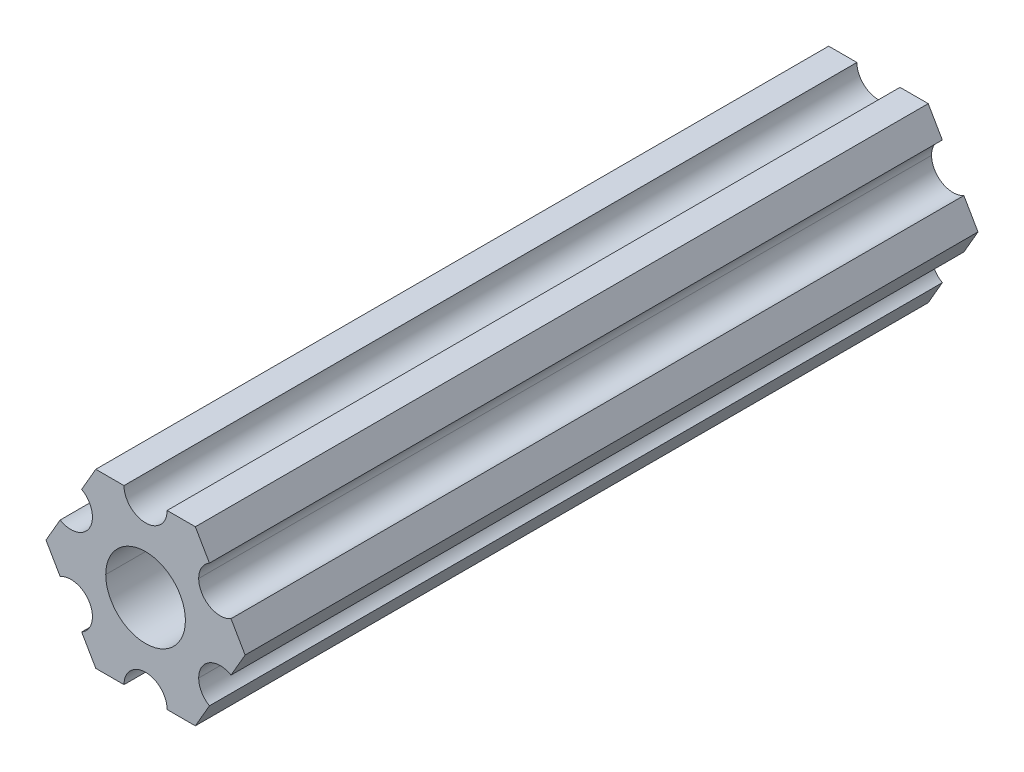
ISO-10303-21;
HEADER;
FILE_DESCRIPTION(('STEP AP214'),'2;1');
FILE_NAME('part.step','',(''),(''),'','','');
FILE_SCHEMA(('AUTOMOTIVE_DESIGN { 1 0 10303 214 1 1 1 1 }'));
ENDSEC;
DATA;
#1=APPLICATION_CONTEXT('core data for automotive mechanical design processes');
#2=APPLICATION_PROTOCOL_DEFINITION('international standard','automotive_design',2000,#1);
#3=PRODUCT_CONTEXT('',#1,'mechanical');
#4=PRODUCT('Part','Part','',(#3));
#5=PRODUCT_RELATED_PRODUCT_CATEGORY('part','',(#4));
#6=PRODUCT_DEFINITION_FORMATION('','',#4);
#7=PRODUCT_DEFINITION_CONTEXT('part definition',#1,'design');
#8=PRODUCT_DEFINITION('design','',#6,#7);
#9=PRODUCT_DEFINITION_SHAPE('','',#8);
#10=(LENGTH_UNIT() NAMED_UNIT(*) SI_UNIT(.MILLI.,.METRE.));
#11=(NAMED_UNIT(*) PLANE_ANGLE_UNIT() SI_UNIT($,.RADIAN.));
#12=(NAMED_UNIT(*) SI_UNIT($,.STERADIAN.) SOLID_ANGLE_UNIT());
#13=UNCERTAINTY_MEASURE_WITH_UNIT(LENGTH_MEASURE(1.E-05),#10,'distance_accuracy_value','');
#14=(GEOMETRIC_REPRESENTATION_CONTEXT(3) GLOBAL_UNCERTAINTY_ASSIGNED_CONTEXT((#13)) GLOBAL_UNIT_ASSIGNED_CONTEXT((#10,
#11,#12)) REPRESENTATION_CONTEXT('',''));
#15=CARTESIAN_POINT('',(0.,0.,0.));
#16=DIRECTION('',(0.,0.,1.));
#17=DIRECTION('',(1.,0.,0.));
#18=AXIS2_PLACEMENT_3D('',#15,#16,#17);
#19=CARTESIAN_POINT('',(0.,0.,304.8));
#20=DIRECTION('',(0.,0.,-1.));
#21=DIRECTION('',(-1.,0.,0.));
#22=AXIS2_PLACEMENT_3D('',#19,#20,#21);
#23=CYLINDRICAL_SURFACE('',#22,2.9337);
#24=CARTESIAN_POINT('',(0.,0.,53.975));
#25=DIRECTION('',(0.,0.,1.));
#26=DIRECTION('',(1.,0.,0.));
#27=AXIS2_PLACEMENT_3D('',#24,#25,#26);
#28=CIRCLE('',#27,2.9337);
#29=CARTESIAN_POINT('',(2.9337,0.,53.975));
#30=VERTEX_POINT('',#29);
#31=CARTESIAN_POINT('',(-2.9337,0.,53.975));
#32=VERTEX_POINT('',#31);
#33=EDGE_CURVE('E68',#30,#32,#28,.F.);
#34=ORIENTED_EDGE('',*,*,#33,.F.);
#35=DIRECTION('',(0.,0.,-1.));
#36=VECTOR('',#35,1.);
#37=CARTESIAN_POINT('',(2.9337,0.,304.8));
#38=LINE('',#37,#36);
#39=CARTESIAN_POINT('',(2.9337,0.,0.));
#40=VERTEX_POINT('',#39);
#41=EDGE_CURVE('E55',#30,#40,#38,.T.);
#42=ORIENTED_EDGE('',*,*,#41,.T.);
#43=CARTESIAN_POINT('',(0.,0.,0.));
#44=DIRECTION('',(0.,0.,1.));
#45=DIRECTION('',(1.,0.,0.));
#46=AXIS2_PLACEMENT_3D('',#43,#44,#45);
#47=CIRCLE('',#46,2.9337);
#48=CARTESIAN_POINT('',(-2.9337,0.,0.));
#49=VERTEX_POINT('',#48);
#50=EDGE_CURVE('E251',#49,#40,#47,.T.);
#51=ORIENTED_EDGE('',*,*,#50,.F.);
#52=DIRECTION('',(0.,0.,-1.));
#53=VECTOR('',#52,1.);
#54=CARTESIAN_POINT('',(-2.9337,0.,304.8));
#55=LINE('',#54,#53);
#56=EDGE_CURVE('E221',#32,#49,#55,.T.);
#57=ORIENTED_EDGE('',*,*,#56,.F.);
#58=EDGE_LOOP('',(#34,#42,#51,#57));
#59=FACE_BOUND('',#58,.T.);
#60=ADVANCED_FACE('F48',(#59),#23,.F.);
#61=CARTESIAN_POINT('',(5.49926150638082,-3.17499966684067,304.8));
#62=DIRECTION('',(0.,0.,-1.));
#63=DIRECTION('',(-1.,0.,0.));
#64=AXIS2_PLACEMENT_3D('',#61,#62,#63);
#65=CYLINDRICAL_SURFACE('',#64,1.5875);
#66=CARTESIAN_POINT('',(5.49926150638082,-3.17499966684067,53.975));
#67=DIRECTION('',(0.,0.,1.));
#68=DIRECTION('',(1.,0.,0.));
#69=AXIS2_PLACEMENT_3D('',#66,#67,#68);
#70=CIRCLE('',#69,1.5875);
#71=CARTESIAN_POINT('',(3.91176150638082,-3.17499966684067,53.975));
#72=VERTEX_POINT('',#71);
#73=CARTESIAN_POINT('',(6.29301142309098,-1.80018429024546,53.975));
#74=VERTEX_POINT('',#73);
#75=EDGE_CURVE('E375',#72,#74,#70,.F.);
#76=ORIENTED_EDGE('',*,*,#75,.F.);
#77=DIRECTION('',(0.,0.,-1.));
#78=VECTOR('',#77,1.);
#79=CARTESIAN_POINT('',(3.91176150638082,-3.17499966684067,304.8));
#80=LINE('',#79,#78);
#81=CARTESIAN_POINT('',(3.91176150638082,-3.17499966684067,0.));
#82=VERTEX_POINT('',#81);
#83=EDGE_CURVE('E228',#72,#82,#80,.T.);
#84=ORIENTED_EDGE('',*,*,#83,.T.);
#85=CARTESIAN_POINT('',(5.49926150638082,-3.17499966684067,0.));
#86=DIRECTION('',(0.,0.,-1.));
#87=DIRECTION('',(1.,0.,0.));
#88=AXIS2_PLACEMENT_3D('',#85,#86,#87);
#89=CIRCLE('',#88,1.5875);
#90=CARTESIAN_POINT('',(6.29301142309098,-1.80018429024546,0.));
#91=VERTEX_POINT('',#90);
#92=EDGE_CURVE('E230',#82,#91,#89,.T.);
#93=ORIENTED_EDGE('',*,*,#92,.T.);
#94=DIRECTION('',(0.,0.,-1.));
#95=VECTOR('',#94,1.);
#96=CARTESIAN_POINT('',(6.29301142309098,-1.80018429024546,304.8));
#97=LINE('',#96,#95);
#98=EDGE_CURVE('E356',#74,#91,#97,.T.);
#99=ORIENTED_EDGE('',*,*,#98,.F.);
#100=EDGE_LOOP('',(#76,#84,#93,#99));
#101=FACE_BOUND('',#100,.T.);
#102=ADVANCED_FACE('F411',(#101),#65,.F.);
#103=CARTESIAN_POINT('',(5.49926112168156,3.17500033315934,304.8));
#104=DIRECTION('',(0.,0.,-1.));
#105=DIRECTION('',(-1.,0.,0.));
#106=AXIS2_PLACEMENT_3D('',#103,#104,#105);
#107=CYLINDRICAL_SURFACE('',#106,1.5875);
#108=CARTESIAN_POINT('',(5.49926112168156,3.17500033315934,53.975));
#109=DIRECTION('',(0.,0.,1.));
#110=DIRECTION('',(1.,0.,0.));
#111=AXIS2_PLACEMENT_3D('',#108,#109,#110);
#112=CIRCLE('',#111,1.5875);
#113=CARTESIAN_POINT('',(3.91176112168156,3.17500033315934,53.975));
#114=VERTEX_POINT('',#113);
#115=CARTESIAN_POINT('',(4.70551103839172,4.54981561357972,53.975));
#116=VERTEX_POINT('',#115);
#117=EDGE_CURVE('E377',#114,#116,#112,.F.);
#118=ORIENTED_EDGE('',*,*,#117,.F.);
#119=DIRECTION('',(0.,0.,-1.));
#120=VECTOR('',#119,1.);
#121=CARTESIAN_POINT('',(3.91176112168156,3.17500033315934,304.8));
#122=LINE('',#121,#120);
#123=CARTESIAN_POINT('',(3.91176112168156,3.17500033315934,0.));
#124=VERTEX_POINT('',#123);
#125=EDGE_CURVE('E250',#114,#124,#122,.T.);
#126=ORIENTED_EDGE('',*,*,#125,.T.);
#127=CARTESIAN_POINT('',(5.49926112168156,3.17500033315934,0.));
#128=DIRECTION('',(0.,0.,-1.));
#129=DIRECTION('',(1.,0.,0.));
#130=AXIS2_PLACEMENT_3D('',#127,#128,#129);
#131=CIRCLE('',#130,1.5875);
#132=CARTESIAN_POINT('',(4.70551103839172,4.54981561357972,0.));
#133=VERTEX_POINT('',#132);
#134=EDGE_CURVE('E246',#124,#133,#131,.T.);
#135=ORIENTED_EDGE('',*,*,#134,.T.);
#136=DIRECTION('',(0.,0.,-1.));
#137=VECTOR('',#136,1.);
#138=CARTESIAN_POINT('',(4.70551103839172,4.54981561357972,304.8));
#139=LINE('',#138,#137);
#140=EDGE_CURVE('E289',#116,#133,#139,.T.);
#141=ORIENTED_EDGE('',*,*,#140,.F.);
#142=EDGE_LOOP('',(#118,#126,#135,#141));
#143=FACE_BOUND('',#142,.T.);
#144=ADVANCED_FACE('F485',(#143),#107,.F.);
#145=CARTESIAN_POINT('',(6.29301142309098,-1.80018429024546,304.8));
#146=DIRECTION('',(-0.866025434075723,0.499999947533953,0.));
#147=DIRECTION('',(0.,0.,1.));
#148=AXIS2_PLACEMENT_3D('',#145,#146,#147);
#149=PLANE('',#148);
#150=DIRECTION('',(0.499999947533953,0.866025434075723,0.));
#151=VECTOR('',#150,1.);
#152=CARTESIAN_POINT('',(6.29301142309098,-1.80018429024546,53.975));
#153=LINE('',#152,#151);
#154=CARTESIAN_POINT('',(7.33234841870827,4.44212519169686E-07,53.975));
#155=VERTEX_POINT('',#154);
#156=EDGE_CURVE('E295',#74,#155,#153,.T.);
#157=ORIENTED_EDGE('',*,*,#156,.F.);
#158=ORIENTED_EDGE('',*,*,#98,.T.);
#159=DIRECTION('',(0.499999947533953,0.866025434075723,0.));
#160=VECTOR('',#159,1.);
#161=CARTESIAN_POINT('',(6.29301142309098,-1.80018429024546,0.));
#162=LINE('',#161,#160);
#163=CARTESIAN_POINT('',(7.33234841870827,4.44212519169686E-07,0.));
#164=VERTEX_POINT('',#163);
#165=EDGE_CURVE('E254',#91,#164,#162,.T.);
#166=ORIENTED_EDGE('',*,*,#165,.T.);
#167=DIRECTION('',(0.,0.,-1.));
#168=VECTOR('',#167,1.);
#169=CARTESIAN_POINT('',(7.33234841870827,4.44212519169686E-07,304.8));
#170=LINE('',#169,#168);
#171=EDGE_CURVE('E261',#155,#164,#170,.T.);
#172=ORIENTED_EDGE('',*,*,#171,.F.);
#173=EDGE_LOOP('',(#157,#158,#166,#172));
#174=FACE_BOUND('',#173,.T.);
#175=ADVANCED_FACE('F494',(#174),#149,.F.);
#176=CARTESIAN_POINT('',(7.33234841870827,4.44212519169686E-07,304.8));
#177=DIRECTION('',(-0.866025373493145,-0.500000052466057,0.));
#178=DIRECTION('',(-0.500000052466057,0.866025373493145,0.));
#179=AXIS2_PLACEMENT_3D('',#176,#177,#178);
#180=PLANE('',#179);
#181=DIRECTION('',(-0.500000052466057,0.866025373493145,0.));
#182=VECTOR('',#181,1.);
#183=CARTESIAN_POINT('',(7.33234841870827,4.44212519169686E-07,53.975));
#184=LINE('',#183,#182);
#185=CARTESIAN_POINT('',(6.29301120497139,1.80018505273895,53.975));
#186=VERTEX_POINT('',#185);
#187=EDGE_CURVE('E371',#155,#186,#184,.T.);
#188=ORIENTED_EDGE('',*,*,#187,.F.);
#189=ORIENTED_EDGE('',*,*,#171,.T.);
#190=DIRECTION('',(-0.500000052466056,0.866025373493145,0.));
#191=VECTOR('',#190,1.);
#192=CARTESIAN_POINT('',(7.33234841870827,4.44212519169686E-07,0.));
#193=LINE('',#192,#191);
#194=CARTESIAN_POINT('',(6.29301120497139,1.80018505273894,0.));
#195=VERTEX_POINT('',#194);
#196=EDGE_CURVE('E344',#164,#195,#193,.T.);
#197=ORIENTED_EDGE('',*,*,#196,.T.);
#198=DIRECTION('',(0.,0.,-1.));
#199=VECTOR('',#198,1.);
#200=CARTESIAN_POINT('',(6.29301120497139,1.80018505273894,304.8));
#201=LINE('',#200,#199);
#202=EDGE_CURVE('E259',#186,#195,#201,.T.);
#203=ORIENTED_EDGE('',*,*,#202,.F.);
#204=EDGE_LOOP('',(#188,#189,#197,#203));
#205=FACE_BOUND('',#204,.T.);
#206=ADVANCED_FACE('F492',(#205),#180,.F.);
#207=CARTESIAN_POINT('',(5.49926112168156,3.17500033315934,304.8));
#208=DIRECTION('',(0.,0.,-1.));
#209=DIRECTION('',(-1.,0.,0.));
#210=AXIS2_PLACEMENT_3D('',#207,#208,#209);
#211=CYLINDRICAL_SURFACE('',#210,1.5875);
#212=CARTESIAN_POINT('',(5.49926112168156,3.17500033315934,53.975));
#213=DIRECTION('',(0.,0.,1.));
#214=DIRECTION('',(1.,0.,0.));
#215=AXIS2_PLACEMENT_3D('',#212,#213,#214);
#216=CIRCLE('',#215,1.5875);
#217=EDGE_CURVE('E373',#186,#114,#216,.F.);
#218=ORIENTED_EDGE('',*,*,#217,.F.);
#219=ORIENTED_EDGE('',*,*,#202,.T.);
#220=CARTESIAN_POINT('',(5.49926112168156,3.17500033315934,0.));
#221=DIRECTION('',(0.,0.,-1.));
#222=DIRECTION('',(1.,0.,0.));
#223=AXIS2_PLACEMENT_3D('',#220,#221,#222);
#224=CIRCLE('',#223,1.5875);
#225=EDGE_CURVE('E262',#195,#124,#224,.T.);
#226=ORIENTED_EDGE('',*,*,#225,.T.);
#227=ORIENTED_EDGE('',*,*,#125,.F.);
#228=EDGE_LOOP('',(#218,#219,#226,#227));
#229=FACE_BOUND('',#228,.T.);
#230=ADVANCED_FACE('F490',(#229),#211,.F.);
#231=CARTESIAN_POINT('',(4.70551103839172,4.54981561357972,304.8));
#232=DIRECTION('',(-0.866025373493151,-0.500000052466046,0.));
#233=DIRECTION('',(-0.500000052466046,0.866025373493151,0.));
#234=AXIS2_PLACEMENT_3D('',#231,#232,#233);
#235=PLANE('',#234);
#236=DIRECTION('',(-0.500000052466046,0.866025373493151,0.));
#237=VECTOR('',#236,1.);
#238=CARTESIAN_POINT('',(4.70551103839172,4.54981561357972,53.975));
#239=LINE('',#238,#237);
#240=CARTESIAN_POINT('',(3.66617382465481,6.35000022210627,53.975));
#241=VERTEX_POINT('',#240);
#242=EDGE_CURVE('E379',#116,#241,#239,.T.);
#243=ORIENTED_EDGE('',*,*,#242,.F.);
#244=ORIENTED_EDGE('',*,*,#140,.T.);
#245=DIRECTION('',(-0.500000052466046,0.866025373493151,0.));
#246=VECTOR('',#245,1.);
#247=CARTESIAN_POINT('',(4.70551103839172,4.54981561357972,0.));
#248=LINE('',#247,#246);
#249=CARTESIAN_POINT('',(3.66617382465481,6.35000022210627,0.));
#250=VERTEX_POINT('',#249);
#251=EDGE_CURVE('E308',#133,#250,#248,.T.);
#252=ORIENTED_EDGE('',*,*,#251,.T.);
#253=DIRECTION('',(0.,0.,-1.));
#254=VECTOR('',#253,1.);
#255=CARTESIAN_POINT('',(3.66617382465481,6.35000022210627,304.8));
#256=LINE('',#255,#254);
#257=EDGE_CURVE('E290',#241,#250,#256,.T.);
#258=ORIENTED_EDGE('',*,*,#257,.F.);
#259=EDGE_LOOP('',(#243,#244,#252,#258));
#260=FACE_BOUND('',#259,.T.);
#261=ADVANCED_FACE('F481',(#260),#235,.F.);
#262=CARTESIAN_POINT('',(3.66617382465481,6.35000022210627,304.8));
#263=DIRECTION('',(6.05825850611185E-08,-1.,0.));
#264=DIRECTION('',(0.,0.,-1.));
#265=AXIS2_PLACEMENT_3D('',#262,#263,#264);
#266=PLANE('',#265);
#267=DIRECTION('',(-0.999999999999998,-6.05825850611184E-08,0.));
#268=VECTOR('',#267,1.);
#269=CARTESIAN_POINT('',(3.66617382465481,6.35000022210627,53.975));
#270=LINE('',#269,#268);
#271=CARTESIAN_POINT('',(1.58749961530074,6.35,53.975));
#272=VERTEX_POINT('',#271);
#273=EDGE_CURVE('E381',#241,#272,#270,.T.);
#274=ORIENTED_EDGE('',*,*,#273,.F.);
#275=ORIENTED_EDGE('',*,*,#257,.T.);
#276=DIRECTION('',(-1.,-6.05825850611185E-08,0.));
#277=VECTOR('',#276,1.);
#278=CARTESIAN_POINT('',(3.66617382465481,6.35000022210627,0.));
#279=LINE('',#278,#277);
#280=CARTESIAN_POINT('',(1.58749961530074,6.35000009617482,0.));
#281=VERTEX_POINT('',#280);
#282=EDGE_CURVE('E285',#250,#281,#279,.T.);
#283=ORIENTED_EDGE('',*,*,#282,.T.);
#284=DIRECTION('',(0.,0.,-1.));
#285=VECTOR('',#284,1.);
#286=CARTESIAN_POINT('',(1.58749961530074,6.35000009617482,304.8));
#287=LINE('',#286,#285);
#288=EDGE_CURVE('E263',#272,#281,#287,.T.);
#289=ORIENTED_EDGE('',*,*,#288,.F.);
#290=EDGE_LOOP('',(#274,#275,#283,#289));
#291=FACE_BOUND('',#290,.T.);
#292=ADVANCED_FACE('F475',(#291),#266,.F.);
#293=CARTESIAN_POINT('',(-3.84699260060323E-07,6.35,304.8));
#294=DIRECTION('',(0.,0.,-1.));
#295=DIRECTION('',(-1.,0.,0.));
#296=AXIS2_PLACEMENT_3D('',#293,#294,#295);
#297=CYLINDRICAL_SURFACE('',#296,1.5875);
#298=CARTESIAN_POINT('',(-3.84699260060323E-07,6.35,53.975));
#299=DIRECTION('',(0.,0.,1.));
#300=DIRECTION('',(1.,0.,0.));
#301=AXIS2_PLACEMENT_3D('',#298,#299,#300);
#302=CIRCLE('',#301,1.5875);
#303=CARTESIAN_POINT('',(-1.58750038469926,6.34999990382518,53.975));
#304=VERTEX_POINT('',#303);
#305=EDGE_CURVE('E383',#272,#304,#302,.F.);
#306=ORIENTED_EDGE('',*,*,#305,.F.);
#307=ORIENTED_EDGE('',*,*,#288,.T.);
#308=CARTESIAN_POINT('',(-3.84699260060323E-07,6.35,0.));
#309=DIRECTION('',(0.,0.,-1.));
#310=DIRECTION('',(1.,0.,0.));
#311=AXIS2_PLACEMENT_3D('',#308,#309,#310);
#312=CIRCLE('',#311,1.5875);
#313=CARTESIAN_POINT('',(-1.58750038469926,6.34999990382519,0.));
#314=VERTEX_POINT('',#313);
#315=EDGE_CURVE('E265',#281,#314,#312,.T.);
#316=ORIENTED_EDGE('',*,*,#315,.T.);
#317=DIRECTION('',(0.,0.,-1.));
#318=VECTOR('',#317,1.);
#319=CARTESIAN_POINT('',(-1.58750038469926,6.34999990382519,304.8));
#320=LINE('',#319,#318);
#321=EDGE_CURVE('E302',#304,#314,#320,.T.);
#322=ORIENTED_EDGE('',*,*,#321,.F.);
#323=EDGE_LOOP('',(#306,#307,#316,#322));
#324=FACE_BOUND('',#323,.T.);
#325=ADVANCED_FACE('F471',(#324),#297,.F.);
#326=CARTESIAN_POINT('',(-1.58750038469926,6.34999990382518,304.8));
#327=DIRECTION('',(6.05825963273174E-08,-1.,0.));
#328=DIRECTION('',(0.,0.,-1.));
#329=AXIS2_PLACEMENT_3D('',#326,#327,#328);
#330=PLANE('',#329);
#331=DIRECTION('',(-0.999999999999998,-6.05825963273173E-08,0.));
#332=VECTOR('',#331,1.);
#333=CARTESIAN_POINT('',(-1.58750038469926,6.34999990382518,53.975));
#334=LINE('',#333,#332);
#335=CARTESIAN_POINT('',(-3.66617459405349,6.3499997778937,53.975));
#336=VERTEX_POINT('',#335);
#337=EDGE_CURVE('E385',#304,#336,#334,.T.);
#338=ORIENTED_EDGE('',*,*,#337,.F.);
#339=ORIENTED_EDGE('',*,*,#321,.T.);
#340=DIRECTION('',(-1.,-6.05825963273174E-08,0.));
#341=VECTOR('',#340,1.);
#342=CARTESIAN_POINT('',(-1.58750038469926,6.34999990382518,0.));
#343=LINE('',#342,#341);
#344=CARTESIAN_POINT('',(-3.66617459405349,6.3499997778937,0.));
#345=VERTEX_POINT('',#344);
#346=EDGE_CURVE('E266',#314,#345,#343,.T.);
#347=ORIENTED_EDGE('',*,*,#346,.T.);
#348=DIRECTION('',(0.,0.,-1.));
#349=VECTOR('',#348,1.);
#350=CARTESIAN_POINT('',(-3.66617459405349,6.3499997778937,304.8));
#351=LINE('',#350,#349);
#352=EDGE_CURVE('E281',#336,#345,#351,.T.);
#353=ORIENTED_EDGE('',*,*,#352,.F.);
#354=EDGE_LOOP('',(#338,#339,#347,#353));
#355=FACE_BOUND('',#354,.T.);
#356=ADVANCED_FACE('F513',(#355),#330,.F.);
#357=CARTESIAN_POINT('',(-3.66617459405349,6.3499997778937,304.8));
#358=DIRECTION('',(0.866025434075729,-0.499999947533942,0.));
#359=DIRECTION('',(0.,0.,-1.));
#360=AXIS2_PLACEMENT_3D('',#357,#358,#359);
#361=PLANE('',#360);
#362=DIRECTION('',(-0.499999947533942,-0.866025434075729,0.));
#363=VECTOR('',#362,1.);
#364=CARTESIAN_POINT('',(-3.66617459405349,6.3499997778937,53.975));
#365=LINE('',#364,#363);
#366=CARTESIAN_POINT('',(-4.70551158967065,4.54981504343587,53.975));
#367=VERTEX_POINT('',#366);
#368=EDGE_CURVE('E387',#336,#367,#365,.T.);
#369=ORIENTED_EDGE('',*,*,#368,.F.);
#370=ORIENTED_EDGE('',*,*,#352,.T.);
#371=DIRECTION('',(-0.499999947533943,-0.866025434075729,0.));
#372=VECTOR('',#371,1.);
#373=CARTESIAN_POINT('',(-3.66617459405349,6.3499997778937,0.));
#374=LINE('',#373,#372);
#375=CARTESIAN_POINT('',(-4.70551158967065,4.54981504343587,0.));
#376=VERTEX_POINT('',#375);
#377=EDGE_CURVE('E283',#345,#376,#374,.T.);
#378=ORIENTED_EDGE('',*,*,#377,.T.);
#379=DIRECTION('',(0.,0.,-1.));
#380=VECTOR('',#379,1.);
#381=CARTESIAN_POINT('',(-4.70551158967065,4.54981504343587,304.8));
#382=LINE('',#381,#380);
#383=EDGE_CURVE('E258',#367,#376,#382,.T.);
#384=ORIENTED_EDGE('',*,*,#383,.F.);
#385=EDGE_LOOP('',(#369,#370,#378,#384));
#386=FACE_BOUND('',#385,.T.);
#387=ADVANCED_FACE('F466',(#386),#361,.F.);
#388=CARTESIAN_POINT('',(-5.49926150638082,3.17499966684067,304.8));
#389=DIRECTION('',(0.,0.,-1.));
#390=DIRECTION('',(-1.,0.,0.));
#391=AXIS2_PLACEMENT_3D('',#388,#389,#390);
#392=CYLINDRICAL_SURFACE('',#391,1.5875);
#393=CARTESIAN_POINT('',(-5.49926150638082,3.17499966684067,53.975));
#394=DIRECTION('',(0.,0.,1.));
#395=DIRECTION('',(1.,0.,0.));
#396=AXIS2_PLACEMENT_3D('',#393,#394,#395);
#397=CIRCLE('',#396,1.5875);
#398=CARTESIAN_POINT('',(-6.29301142309098,1.80018429024547,53.975));
#399=VERTEX_POINT('',#398);
#400=EDGE_CURVE('E389',#367,#399,#397,.F.);
#401=ORIENTED_EDGE('',*,*,#400,.F.);
#402=ORIENTED_EDGE('',*,*,#383,.T.);
#403=CARTESIAN_POINT('',(-5.49926150638082,3.17499966684067,0.));
#404=DIRECTION('',(0.,0.,-1.));
#405=DIRECTION('',(1.,0.,0.));
#406=AXIS2_PLACEMENT_3D('',#403,#404,#405);
#407=CIRCLE('',#406,1.5875);
#408=CARTESIAN_POINT('',(-6.29301142309098,1.80018429024547,0.));
#409=VERTEX_POINT('',#408);
#410=EDGE_CURVE('E284',#376,#409,#407,.T.);
#411=ORIENTED_EDGE('',*,*,#410,.T.);
#412=DIRECTION('',(0.,0.,-1.));
#413=VECTOR('',#412,1.);
#414=CARTESIAN_POINT('',(-6.29301142309098,1.80018429024547,304.8));
#415=LINE('',#414,#413);
#416=EDGE_CURVE('E234',#399,#409,#415,.T.);
#417=ORIENTED_EDGE('',*,*,#416,.F.);
#418=EDGE_LOOP('',(#401,#402,#411,#417));
#419=FACE_BOUND('',#418,.T.);
#420=ADVANCED_FACE('F462',(#419),#392,.F.);
#421=CARTESIAN_POINT('',(-6.29301142309098,1.80018429024547,304.8));
#422=DIRECTION('',(0.866025434075724,-0.499999947533952,0.));
#423=DIRECTION('',(0.,0.,-1.));
#424=AXIS2_PLACEMENT_3D('',#421,#422,#423);
#425=PLANE('',#424);
#426=DIRECTION('',(-0.499999947533952,-0.866025434075724,0.));
#427=VECTOR('',#426,1.);
#428=CARTESIAN_POINT('',(-6.29301142309098,1.80018429024547,53.975));
#429=LINE('',#428,#427);
#430=CARTESIAN_POINT('',(-7.33234841870827,-4.44212523790841E-07,53.975));
#431=VERTEX_POINT('',#430);
#432=EDGE_CURVE('E391',#399,#431,#429,.T.);
#433=ORIENTED_EDGE('',*,*,#432,.F.);
#434=ORIENTED_EDGE('',*,*,#416,.T.);
#435=DIRECTION('',(-0.499999947533951,-0.866025434075724,0.));
#436=VECTOR('',#435,1.);
#437=CARTESIAN_POINT('',(-6.29301142309098,1.80018429024547,0.));
#438=LINE('',#437,#436);
#439=CARTESIAN_POINT('',(-7.33234841870827,-4.44212523790841E-07,0.));
#440=VERTEX_POINT('',#439);
#441=EDGE_CURVE('E236',#409,#440,#438,.T.);
#442=ORIENTED_EDGE('',*,*,#441,.T.);
#443=DIRECTION('',(0.,0.,-1.));
#444=VECTOR('',#443,1.);
#445=CARTESIAN_POINT('',(-7.33234841870827,-4.44212523790841E-07,304.8));
#446=LINE('',#445,#444);
#447=EDGE_CURVE('E267',#431,#440,#446,.T.);
#448=ORIENTED_EDGE('',*,*,#447,.F.);
#449=EDGE_LOOP('',(#433,#434,#442,#448));
#450=FACE_BOUND('',#449,.T.);
#451=ADVANCED_FACE('F456',(#450),#425,.F.);
#452=CARTESIAN_POINT('',(-7.33234841870827,-4.44212523790841E-07,304.8));
#453=DIRECTION('',(0.866025373493151,0.500000052466045,0.));
#454=DIRECTION('',(0.,0.,-1.));
#455=AXIS2_PLACEMENT_3D('',#452,#453,#454);
#456=PLANE('',#455);
#457=DIRECTION('',(0.500000052466045,-0.866025373493151,0.));
#458=VECTOR('',#457,1.);
#459=CARTESIAN_POINT('',(-7.33234841870827,-4.44212523790841E-07,53.975));
#460=LINE('',#459,#458);
#461=CARTESIAN_POINT('',(-6.29301120497141,-1.80018505273896,53.975));
#462=VERTEX_POINT('',#461);
#463=EDGE_CURVE('E393',#431,#462,#460,.T.);
#464=ORIENTED_EDGE('',*,*,#463,.F.);
#465=ORIENTED_EDGE('',*,*,#447,.T.);
#466=DIRECTION('',(0.500000052466045,-0.866025373493151,0.));
#467=VECTOR('',#466,1.);
#468=CARTESIAN_POINT('',(-7.33234841870827,-4.44212523790841E-07,0.));
#469=LINE('',#468,#467);
#470=CARTESIAN_POINT('',(-6.29301120497141,-1.80018505273897,0.));
#471=VERTEX_POINT('',#470);
#472=EDGE_CURVE('E237',#440,#471,#469,.T.);
#473=ORIENTED_EDGE('',*,*,#472,.T.);
#474=DIRECTION('',(0.,0.,-1.));
#475=VECTOR('',#474,1.);
#476=CARTESIAN_POINT('',(-6.29301120497141,-1.80018505273897,304.8));
#477=LINE('',#476,#475);
#478=EDGE_CURVE('E245',#462,#471,#477,.T.);
#479=ORIENTED_EDGE('',*,*,#478,.F.);
#480=EDGE_LOOP('',(#464,#465,#473,#479));
#481=FACE_BOUND('',#480,.T.);
#482=ADVANCED_FACE('F452',(#481),#456,.F.);
#483=CARTESIAN_POINT('',(-5.49926112168156,-3.17500033315934,304.8));
#484=DIRECTION('',(0.,0.,-1.));
#485=DIRECTION('',(-1.,0.,0.));
#486=AXIS2_PLACEMENT_3D('',#483,#484,#485);
#487=CYLINDRICAL_SURFACE('',#486,1.5875);
#488=CARTESIAN_POINT('',(-5.49926112168156,-3.17500033315934,53.975));
#489=DIRECTION('',(0.,0.,1.));
#490=DIRECTION('',(1.,0.,0.));
#491=AXIS2_PLACEMENT_3D('',#488,#489,#490);
#492=CIRCLE('',#491,1.5875);
#493=CARTESIAN_POINT('',(-4.70551103839172,-4.54981561357972,53.975));
#494=VERTEX_POINT('',#493);
#495=EDGE_CURVE('E395',#462,#494,#492,.F.);
#496=ORIENTED_EDGE('',*,*,#495,.F.);
#497=ORIENTED_EDGE('',*,*,#478,.T.);
#498=CARTESIAN_POINT('',(-5.49926112168156,-3.17500033315934,0.));
#499=DIRECTION('',(0.,0.,-1.));
#500=DIRECTION('',(1.,0.,0.));
#501=AXIS2_PLACEMENT_3D('',#498,#499,#500);
#502=CIRCLE('',#501,1.5875);
#503=CARTESIAN_POINT('',(-4.70551103839172,-4.54981561357972,0.));
#504=VERTEX_POINT('',#503);
#505=EDGE_CURVE('E269',#471,#504,#502,.T.);
#506=ORIENTED_EDGE('',*,*,#505,.T.);
#507=DIRECTION('',(0.,0.,-1.));
#508=VECTOR('',#507,1.);
#509=CARTESIAN_POINT('',(-4.70551103839172,-4.54981561357972,304.8));
#510=LINE('',#509,#508);
#511=EDGE_CURVE('E238',#494,#504,#510,.T.);
#512=ORIENTED_EDGE('',*,*,#511,.F.);
#513=EDGE_LOOP('',(#496,#497,#506,#512));
#514=FACE_BOUND('',#513,.T.);
#515=ADVANCED_FACE('F446',(#514),#487,.F.);
#516=CARTESIAN_POINT('',(-4.70551103839172,-4.54981561357972,304.8));
#517=DIRECTION('',(0.866025373493152,0.500000052466045,0.));
#518=DIRECTION('',(0.,0.,-1.));
#519=AXIS2_PLACEMENT_3D('',#516,#517,#518);
#520=PLANE('',#519);
#521=DIRECTION('',(0.500000052466045,-0.866025373493152,0.));
#522=VECTOR('',#521,1.);
#523=CARTESIAN_POINT('',(-4.70551103839172,-4.54981561357972,53.975));
#524=LINE('',#523,#522);
#525=CARTESIAN_POINT('',(-3.66617382465481,-6.35000022210628,53.975));
#526=VERTEX_POINT('',#525);
#527=EDGE_CURVE('E397',#494,#526,#524,.T.);
#528=ORIENTED_EDGE('',*,*,#527,.F.);
#529=ORIENTED_EDGE('',*,*,#511,.T.);
#530=DIRECTION('',(0.500000052466045,-0.866025373493152,0.));
#531=VECTOR('',#530,1.);
#532=CARTESIAN_POINT('',(-4.70551103839172,-4.54981561357972,0.));
#533=LINE('',#532,#531);
#534=CARTESIAN_POINT('',(-3.66617382465481,-6.35000022210628,0.));
#535=VERTEX_POINT('',#534);
#536=EDGE_CURVE('E240',#504,#535,#533,.T.);
#537=ORIENTED_EDGE('',*,*,#536,.T.);
#538=DIRECTION('',(0.,0.,-1.));
#539=VECTOR('',#538,1.);
#540=CARTESIAN_POINT('',(-3.66617382465481,-6.35000022210628,304.8));
#541=LINE('',#540,#539);
#542=EDGE_CURVE('E342',#526,#535,#541,.T.);
#543=ORIENTED_EDGE('',*,*,#542,.F.);
#544=EDGE_LOOP('',(#528,#529,#537,#543));
#545=FACE_BOUND('',#544,.T.);
#546=ADVANCED_FACE('F442',(#545),#520,.F.);
#547=CARTESIAN_POINT('',(-3.66617382465481,-6.35000022210628,304.8));
#548=DIRECTION('',(-6.05825854783851E-08,1.,0.));
#549=DIRECTION('',(0.,0.,1.));
#550=AXIS2_PLACEMENT_3D('',#547,#548,#549);
#551=PLANE('',#550);
#552=DIRECTION('',(0.999999999999998,6.0582585478385E-08,0.));
#553=VECTOR('',#552,1.);
#554=CARTESIAN_POINT('',(-3.66617382465481,-6.35000022210628,53.975));
#555=LINE('',#554,#553);
#556=CARTESIAN_POINT('',(-1.58749961530073,-6.35000009617482,53.975));
#557=VERTEX_POINT('',#556);
#558=EDGE_CURVE('E399',#526,#557,#555,.T.);
#559=ORIENTED_EDGE('',*,*,#558,.F.);
#560=ORIENTED_EDGE('',*,*,#542,.T.);
#561=DIRECTION('',(1.,6.05825854783851E-08,0.));
#562=VECTOR('',#561,1.);
#563=CARTESIAN_POINT('',(-3.66617382465481,-6.35000022210628,0.));
#564=LINE('',#563,#562);
#565=CARTESIAN_POINT('',(-1.58749961530073,-6.35000009617482,0.));
#566=VERTEX_POINT('',#565);
#567=EDGE_CURVE('E241',#535,#566,#564,.T.);
#568=ORIENTED_EDGE('',*,*,#567,.T.);
#569=DIRECTION('',(0.,0.,-1.));
#570=VECTOR('',#569,1.);
#571=CARTESIAN_POINT('',(-1.58749961530073,-6.35000009617482,304.8));
#572=LINE('',#571,#570);
#573=EDGE_CURVE('E307',#557,#566,#572,.T.);
#574=ORIENTED_EDGE('',*,*,#573,.F.);
#575=EDGE_LOOP('',(#559,#560,#568,#574));
#576=FACE_BOUND('',#575,.T.);
#577=ADVANCED_FACE('F436',(#576),#551,.F.);
#578=CARTESIAN_POINT('',(3.8469926204343E-07,-6.35,304.8));
#579=DIRECTION('',(0.,0.,-1.));
#580=DIRECTION('',(-1.,0.,0.));
#581=AXIS2_PLACEMENT_3D('',#578,#579,#580);
#582=CYLINDRICAL_SURFACE('',#581,1.5875);
#583=CARTESIAN_POINT('',(3.8469926204343E-07,-6.35,53.975));
#584=DIRECTION('',(0.,0.,1.));
#585=DIRECTION('',(1.,0.,0.));
#586=AXIS2_PLACEMENT_3D('',#583,#584,#585);
#587=CIRCLE('',#586,1.5875);
#588=CARTESIAN_POINT('',(1.58750038469926,-6.34999990382518,53.975));
#589=VERTEX_POINT('',#588);
#590=EDGE_CURVE('E401',#557,#589,#587,.F.);
#591=ORIENTED_EDGE('',*,*,#590,.F.);
#592=ORIENTED_EDGE('',*,*,#573,.T.);
#593=CARTESIAN_POINT('',(3.8469926204343E-07,-6.35,0.));
#594=DIRECTION('',(0.,0.,-1.));
#595=DIRECTION('',(1.,0.,0.));
#596=AXIS2_PLACEMENT_3D('',#593,#594,#595);
#597=CIRCLE('',#596,1.5875);
#598=CARTESIAN_POINT('',(1.58750038469926,-6.34999990382518,0.));
#599=VERTEX_POINT('',#598);
#600=EDGE_CURVE('E338',#566,#599,#597,.T.);
#601=ORIENTED_EDGE('',*,*,#600,.T.);
#602=DIRECTION('',(0.,0.,-1.));
#603=VECTOR('',#602,1.);
#604=CARTESIAN_POINT('',(1.58750038469926,-6.34999990382518,304.8));
#605=LINE('',#604,#603);
#606=EDGE_CURVE('E275',#589,#599,#605,.T.);
#607=ORIENTED_EDGE('',*,*,#606,.F.);
#608=EDGE_LOOP('',(#591,#592,#601,#607));
#609=FACE_BOUND('',#608,.T.);
#610=ADVANCED_FACE('F432',(#609),#582,.F.);
#611=CARTESIAN_POINT('',(1.58750038469926,-6.34999990382518,304.8));
#612=DIRECTION('',(-6.05825721258438E-08,1.,0.));
#613=DIRECTION('',(0.,0.,1.));
#614=AXIS2_PLACEMENT_3D('',#611,#612,#613);
#615=PLANE('',#614);
#616=DIRECTION('',(0.999999999999998,6.05825721258437E-08,0.));
#617=VECTOR('',#616,1.);
#618=CARTESIAN_POINT('',(1.58750038469926,-6.34999990382518,53.975));
#619=LINE('',#618,#617);
#620=CARTESIAN_POINT('',(3.66617459405346,-6.34999977789375,53.975));
#621=VERTEX_POINT('',#620);
#622=EDGE_CURVE('E403',#589,#621,#619,.T.);
#623=ORIENTED_EDGE('',*,*,#622,.F.);
#624=ORIENTED_EDGE('',*,*,#606,.T.);
#625=DIRECTION('',(1.,6.05825721258438E-08,0.));
#626=VECTOR('',#625,1.);
#627=CARTESIAN_POINT('',(1.58750038469926,-6.34999990382518,0.));
#628=LINE('',#627,#626);
#629=CARTESIAN_POINT('',(3.66617459405346,-6.34999977789375,0.));
#630=VERTEX_POINT('',#629);
#631=EDGE_CURVE('E303',#599,#630,#628,.T.);
#632=ORIENTED_EDGE('',*,*,#631,.T.);
#633=DIRECTION('',(0.,0.,-1.));
#634=VECTOR('',#633,1.);
#635=CARTESIAN_POINT('',(3.66617459405346,-6.34999977789375,304.8));
#636=LINE('',#635,#634);
#637=EDGE_CURVE('E276',#621,#630,#636,.T.);
#638=ORIENTED_EDGE('',*,*,#637,.F.);
#639=EDGE_LOOP('',(#623,#624,#632,#638));
#640=FACE_BOUND('',#639,.T.);
#641=ADVANCED_FACE('F426',(#640),#615,.F.);
#642=CARTESIAN_POINT('',(3.66617459405346,-6.34999977789375,304.8));
#643=DIRECTION('',(-0.86602543407573,0.499999947533941,0.));
#644=DIRECTION('',(0.,0.,1.));
#645=AXIS2_PLACEMENT_3D('',#642,#643,#644);
#646=PLANE('',#645);
#647=DIRECTION('',(0.499999947533941,0.86602543407573,0.));
#648=VECTOR('',#647,1.);
#649=CARTESIAN_POINT('',(3.66617459405346,-6.34999977789375,53.975));
#650=LINE('',#649,#648);
#651=CARTESIAN_POINT('',(4.70551158967065,-4.54981504343587,53.975));
#652=VERTEX_POINT('',#651);
#653=EDGE_CURVE('E62',#621,#652,#650,.T.);
#654=ORIENTED_EDGE('',*,*,#653,.F.);
#655=ORIENTED_EDGE('',*,*,#637,.T.);
#656=DIRECTION('',(0.499999947533941,0.86602543407573,0.));
#657=VECTOR('',#656,1.);
#658=CARTESIAN_POINT('',(3.66617459405346,-6.34999977789375,0.));
#659=LINE('',#658,#657);
#660=CARTESIAN_POINT('',(4.70551158967065,-4.54981504343587,0.));
#661=VERTEX_POINT('',#660);
#662=EDGE_CURVE('E271',#630,#661,#659,.T.);
#663=ORIENTED_EDGE('',*,*,#662,.T.);
#664=DIRECTION('',(0.,0.,-1.));
#665=VECTOR('',#664,1.);
#666=CARTESIAN_POINT('',(4.70551158967065,-4.54981504343587,304.8));
#667=LINE('',#666,#665);
#668=EDGE_CURVE('E277',#652,#661,#667,.T.);
#669=ORIENTED_EDGE('',*,*,#668,.F.);
#670=EDGE_LOOP('',(#654,#655,#663,#669));
#671=FACE_BOUND('',#670,.T.);
#672=ADVANCED_FACE('F422',(#671),#646,.F.);
#673=CARTESIAN_POINT('',(5.49926150638082,-3.17499966684067,304.8));
#674=DIRECTION('',(0.,0.,-1.));
#675=DIRECTION('',(-1.,0.,0.));
#676=AXIS2_PLACEMENT_3D('',#673,#674,#675);
#677=CYLINDRICAL_SURFACE('',#676,1.5875);
#678=CARTESIAN_POINT('',(5.49926150638082,-3.17499966684067,53.975));
#679=DIRECTION('',(0.,0.,1.));
#680=DIRECTION('',(1.,0.,0.));
#681=AXIS2_PLACEMENT_3D('',#678,#679,#680);
#682=CIRCLE('',#681,1.5875);
#683=EDGE_CURVE('E222',#652,#72,#682,.F.);
#684=ORIENTED_EDGE('',*,*,#683,.F.);
#685=ORIENTED_EDGE('',*,*,#668,.T.);
#686=CARTESIAN_POINT('',(5.49926150638082,-3.17499966684067,0.));
#687=DIRECTION('',(0.,0.,-1.));
#688=DIRECTION('',(1.,0.,0.));
#689=AXIS2_PLACEMENT_3D('',#686,#687,#688);
#690=CIRCLE('',#689,1.5875);
#691=EDGE_CURVE('E279',#661,#82,#690,.T.);
#692=ORIENTED_EDGE('',*,*,#691,.T.);
#693=ORIENTED_EDGE('',*,*,#83,.F.);
#694=EDGE_LOOP('',(#684,#685,#692,#693));
#695=FACE_BOUND('',#694,.T.);
#696=ADVANCED_FACE('F413',(#695),#677,.F.);
#697=CARTESIAN_POINT('',(0.,0.,304.8));
#698=DIRECTION('',(0.,0.,-1.));
#699=DIRECTION('',(-1.,0.,0.));
#700=AXIS2_PLACEMENT_3D('',#697,#698,#699);
#701=CYLINDRICAL_SURFACE('',#700,2.9337);
#702=CARTESIAN_POINT('',(0.,0.,53.975));
#703=DIRECTION('',(0.,0.,1.));
#704=DIRECTION('',(1.,0.,0.));
#705=AXIS2_PLACEMENT_3D('',#702,#703,#704);
#706=CIRCLE('',#705,2.9337);
#707=EDGE_CURVE('E12',#32,#30,#706,.F.);
#708=ORIENTED_EDGE('',*,*,#707,.F.);
#709=ORIENTED_EDGE('',*,*,#56,.T.);
#710=CARTESIAN_POINT('',(0.,0.,0.));
#711=DIRECTION('',(0.,0.,1.));
#712=DIRECTION('',(1.,0.,0.));
#713=AXIS2_PLACEMENT_3D('',#710,#711,#712);
#714=CIRCLE('',#713,2.9337);
#715=EDGE_CURVE('E227',#40,#49,#714,.T.);
#716=ORIENTED_EDGE('',*,*,#715,.F.);
#717=ORIENTED_EDGE('',*,*,#41,.F.);
#718=EDGE_LOOP('',(#708,#709,#716,#717));
#719=FACE_BOUND('',#718,.T.);
#720=ADVANCED_FACE('F225',(#719),#701,.F.);
#721=CARTESIAN_POINT('',(5.49926112168156,3.17500033315934,0.));
#722=DIRECTION('',(0.,0.,1.));
#723=DIRECTION('',(1.,0.,0.));
#724=AXIS2_PLACEMENT_3D('',#721,#722,#723);
#725=PLANE('',#724);
#726=ORIENTED_EDGE('',*,*,#165,.F.);
#727=ORIENTED_EDGE('',*,*,#92,.F.);
#728=ORIENTED_EDGE('',*,*,#691,.F.);
#729=ORIENTED_EDGE('',*,*,#662,.F.);
#730=ORIENTED_EDGE('',*,*,#631,.F.);
#731=ORIENTED_EDGE('',*,*,#600,.F.);
#732=ORIENTED_EDGE('',*,*,#567,.F.);
#733=ORIENTED_EDGE('',*,*,#536,.F.);
#734=ORIENTED_EDGE('',*,*,#505,.F.);
#735=ORIENTED_EDGE('',*,*,#472,.F.);
#736=ORIENTED_EDGE('',*,*,#441,.F.);
#737=ORIENTED_EDGE('',*,*,#410,.F.);
#738=ORIENTED_EDGE('',*,*,#377,.F.);
#739=ORIENTED_EDGE('',*,*,#346,.F.);
#740=ORIENTED_EDGE('',*,*,#315,.F.);
#741=ORIENTED_EDGE('',*,*,#282,.F.);
#742=ORIENTED_EDGE('',*,*,#251,.F.);
#743=ORIENTED_EDGE('',*,*,#134,.F.);
#744=ORIENTED_EDGE('',*,*,#225,.F.);
#745=ORIENTED_EDGE('',*,*,#196,.F.);
#746=EDGE_LOOP('',(#726,#727,#728,#729,#730,#731,#732,#733,#734,#735,#736,#737,#738,#739,#740,
#741,#742,#743,#744,#745));
#747=FACE_BOUND('',#746,.T.);
#748=ORIENTED_EDGE('',*,*,#50,.T.);
#749=ORIENTED_EDGE('',*,*,#715,.T.);
#750=EDGE_LOOP('',(#748,#749));
#751=FACE_BOUND('',#750,.T.);
#752=ADVANCED_FACE('F418',(#747,#751),#725,.F.);
#753=CARTESIAN_POINT('',(0.,0.,53.975));
#754=DIRECTION('',(0.,0.,1.));
#755=DIRECTION('',(1.,0.,0.));
#756=AXIS2_PLACEMENT_3D('',#753,#754,#755);
#757=PLANE('',#756);
#758=ORIENTED_EDGE('',*,*,#33,.T.);
#759=ORIENTED_EDGE('',*,*,#707,.T.);
#760=EDGE_LOOP('',(#758,#759));
#761=FACE_BOUND('',#760,.T.);
#762=ORIENTED_EDGE('',*,*,#156,.T.);
#763=ORIENTED_EDGE('',*,*,#187,.T.);
#764=ORIENTED_EDGE('',*,*,#217,.T.);
#765=ORIENTED_EDGE('',*,*,#117,.T.);
#766=ORIENTED_EDGE('',*,*,#242,.T.);
#767=ORIENTED_EDGE('',*,*,#273,.T.);
#768=ORIENTED_EDGE('',*,*,#305,.T.);
#769=ORIENTED_EDGE('',*,*,#337,.T.);
#770=ORIENTED_EDGE('',*,*,#368,.T.);
#771=ORIENTED_EDGE('',*,*,#400,.T.);
#772=ORIENTED_EDGE('',*,*,#432,.T.);
#773=ORIENTED_EDGE('',*,*,#463,.T.);
#774=ORIENTED_EDGE('',*,*,#495,.T.);
#775=ORIENTED_EDGE('',*,*,#527,.T.);
#776=ORIENTED_EDGE('',*,*,#558,.T.);
#777=ORIENTED_EDGE('',*,*,#590,.T.);
#778=ORIENTED_EDGE('',*,*,#622,.T.);
#779=ORIENTED_EDGE('',*,*,#653,.T.);
#780=ORIENTED_EDGE('',*,*,#683,.T.);
#781=ORIENTED_EDGE('',*,*,#75,.T.);
#782=EDGE_LOOP('',(#762,#763,#764,#765,#766,#767,#768,#769,#770,#771,#772,#773,#774,#775,#776,
#777,#778,#779,#780,#781));
#783=FACE_BOUND('',#782,.T.);
#784=ADVANCED_FACE('F214',(#761,#783),#757,.T.);
#785=CLOSED_SHELL('',(#60,#102,#144,#175,#206,#230,#261,#292,#325,#356,#387,#420,#451,#482,#515,
#546,#577,#610,#641,#672,#696,#720,#752,#784));
#786=MANIFOLD_SOLID_BREP('B2',#785);
#787=ADVANCED_BREP_SHAPE_REPRESENTATION('',(#18,#786),#14);
#788=SHAPE_DEFINITION_REPRESENTATION(#9,#787);
ENDSEC;
END-ISO-10303-21;
